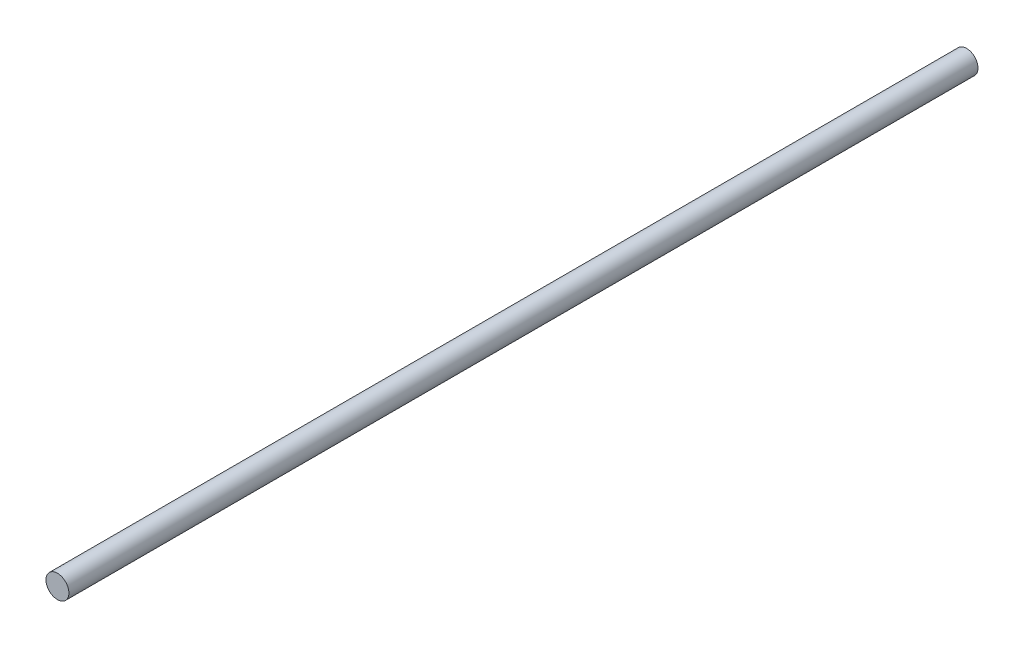
ISO-10303-21;
HEADER;
FILE_DESCRIPTION(('STEP AP214'),'2;1');
FILE_NAME('part.step','',(''),(''),'','','');
FILE_SCHEMA(('AUTOMOTIVE_DESIGN { 1 0 10303 214 1 1 1 1 }'));
ENDSEC;
DATA;
#1=APPLICATION_CONTEXT('core data for automotive mechanical design processes');
#2=APPLICATION_PROTOCOL_DEFINITION('international standard','automotive_design',2000,#1);
#3=PRODUCT_CONTEXT('',#1,'mechanical');
#4=PRODUCT('Part','Part','',(#3));
#5=PRODUCT_RELATED_PRODUCT_CATEGORY('part','',(#4));
#6=PRODUCT_DEFINITION_FORMATION('','',#4);
#7=PRODUCT_DEFINITION_CONTEXT('part definition',#1,'design');
#8=PRODUCT_DEFINITION('design','',#6,#7);
#9=PRODUCT_DEFINITION_SHAPE('','',#8);
#10=(LENGTH_UNIT() NAMED_UNIT(*) SI_UNIT(.MILLI.,.METRE.));
#11=(NAMED_UNIT(*) PLANE_ANGLE_UNIT() SI_UNIT($,.RADIAN.));
#12=(NAMED_UNIT(*) SI_UNIT($,.STERADIAN.) SOLID_ANGLE_UNIT());
#13=UNCERTAINTY_MEASURE_WITH_UNIT(LENGTH_MEASURE(1.E-05),#10,'distance_accuracy_value','');
#14=(GEOMETRIC_REPRESENTATION_CONTEXT(3) GLOBAL_UNCERTAINTY_ASSIGNED_CONTEXT((#13)) GLOBAL_UNIT_ASSIGNED_CONTEXT((#10,
#11,#12)) REPRESENTATION_CONTEXT('',''));
#15=CARTESIAN_POINT('',(0.,0.,0.));
#16=DIRECTION('',(0.,0.,1.));
#17=DIRECTION('',(1.,0.,0.));
#18=AXIS2_PLACEMENT_3D('',#15,#16,#17);
#19=CARTESIAN_POINT('',(0.,0.,236.22));
#20=DIRECTION('',(0.,0.,-1.));
#21=DIRECTION('',(-1.,0.,0.));
#22=AXIS2_PLACEMENT_3D('',#19,#20,#21);
#23=CYLINDRICAL_SURFACE('',#22,2.975);
#24=CARTESIAN_POINT('',(0.,0.,236.22));
#25=DIRECTION('',(0.,0.,1.));
#26=DIRECTION('',(1.,0.,0.));
#27=AXIS2_PLACEMENT_3D('',#24,#25,#26);
#28=CIRCLE('',#27,2.975);
#29=CARTESIAN_POINT('',(2.975,0.,236.22));
#30=VERTEX_POINT('',#29);
#31=EDGE_CURVE('E10',#30,#30,#28,.T.);
#32=ORIENTED_EDGE('',*,*,#31,.F.);
#33=EDGE_LOOP('',(#32));
#34=FACE_BOUND('',#33,.T.);
#35=CARTESIAN_POINT('',(0.,0.,0.));
#36=DIRECTION('',(0.,0.,1.));
#37=DIRECTION('',(1.,0.,0.));
#38=AXIS2_PLACEMENT_3D('',#35,#36,#37);
#39=CIRCLE('',#38,2.975);
#40=CARTESIAN_POINT('',(2.975,0.,0.));
#41=VERTEX_POINT('',#40);
#42=EDGE_CURVE('E34',#41,#41,#39,.T.);
#43=ORIENTED_EDGE('',*,*,#42,.T.);
#44=EDGE_LOOP('',(#43));
#45=FACE_BOUND('',#44,.T.);
#46=ADVANCED_FACE('F31',(#34,#45),#23,.T.);
#47=CARTESIAN_POINT('',(0.,0.,236.22));
#48=DIRECTION('',(0.,0.,1.));
#49=DIRECTION('',(1.,0.,0.));
#50=AXIS2_PLACEMENT_3D('',#47,#48,#49);
#51=PLANE('',#50);
#52=ORIENTED_EDGE('',*,*,#31,.T.);
#53=EDGE_LOOP('',(#52));
#54=FACE_BOUND('',#53,.T.);
#55=ADVANCED_FACE('F46',(#54),#51,.T.);
#56=CARTESIAN_POINT('',(0.,0.,0.));
#57=DIRECTION('',(0.,0.,1.));
#58=DIRECTION('',(1.,0.,0.));
#59=AXIS2_PLACEMENT_3D('',#56,#57,#58);
#60=PLANE('',#59);
#61=ORIENTED_EDGE('',*,*,#42,.F.);
#62=EDGE_LOOP('',(#61));
#63=FACE_BOUND('',#62,.T.);
#64=ADVANCED_FACE('F44',(#63),#60,.F.);
#65=CLOSED_SHELL('',(#46,#55,#64));
#66=MANIFOLD_SOLID_BREP('B2',#65);
#67=ADVANCED_BREP_SHAPE_REPRESENTATION('',(#18,#66),#14);
#68=SHAPE_DEFINITION_REPRESENTATION(#9,#67);
ENDSEC;
END-ISO-10303-21;
